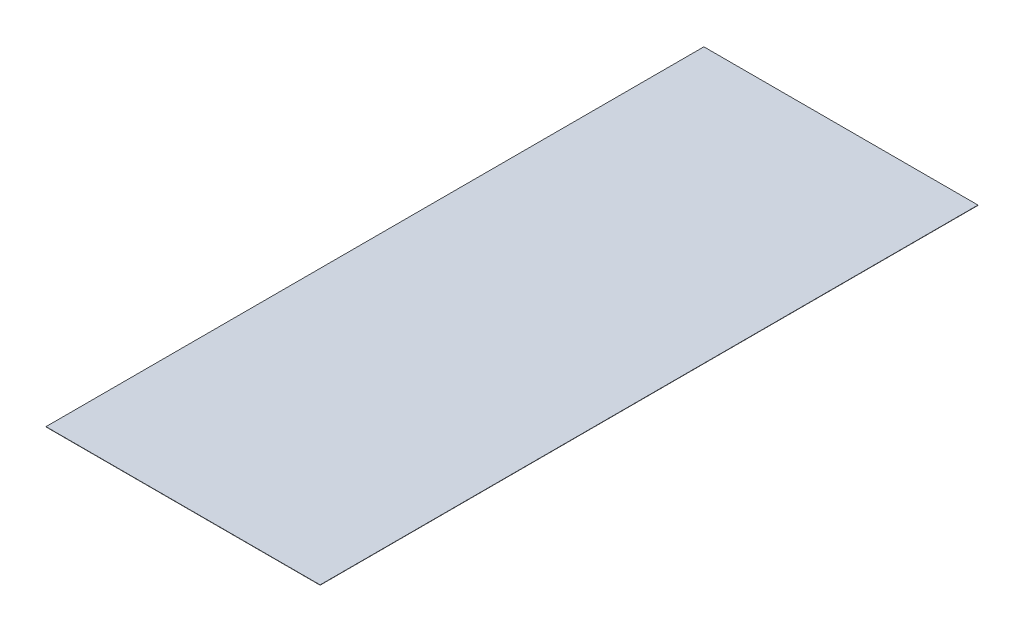
ISO-10303-21;
HEADER;
FILE_DESCRIPTION(('STEP AP214'),'2;1');
FILE_NAME('part.step','',(''),(''),'','','');
FILE_SCHEMA(('AUTOMOTIVE_DESIGN { 1 0 10303 214 1 1 1 1 }'));
ENDSEC;
DATA;
#1=APPLICATION_CONTEXT('core data for automotive mechanical design processes');
#2=APPLICATION_PROTOCOL_DEFINITION('international standard','automotive_design',2000,#1);
#3=PRODUCT_CONTEXT('',#1,'mechanical');
#4=PRODUCT('Part','Part','',(#3));
#5=PRODUCT_RELATED_PRODUCT_CATEGORY('part','',(#4));
#6=PRODUCT_DEFINITION_FORMATION('','',#4);
#7=PRODUCT_DEFINITION_CONTEXT('part definition',#1,'design');
#8=PRODUCT_DEFINITION('design','',#6,#7);
#9=PRODUCT_DEFINITION_SHAPE('','',#8);
#10=(LENGTH_UNIT() NAMED_UNIT(*) SI_UNIT(.MILLI.,.METRE.));
#11=(NAMED_UNIT(*) PLANE_ANGLE_UNIT() SI_UNIT($,.RADIAN.));
#12=(NAMED_UNIT(*) SI_UNIT($,.STERADIAN.) SOLID_ANGLE_UNIT());
#13=UNCERTAINTY_MEASURE_WITH_UNIT(LENGTH_MEASURE(1.E-05),#10,'distance_accuracy_value','');
#14=(GEOMETRIC_REPRESENTATION_CONTEXT(3) GLOBAL_UNCERTAINTY_ASSIGNED_CONTEXT((#13)) GLOBAL_UNIT_ASSIGNED_CONTEXT((#10,
#11,#12)) REPRESENTATION_CONTEXT('',''));
#15=CARTESIAN_POINT('',(0.,0.,0.));
#16=DIRECTION('',(0.,0.,1.));
#17=DIRECTION('',(1.,0.,0.));
#18=AXIS2_PLACEMENT_3D('',#15,#16,#17);
#19=CARTESIAN_POINT('',(-500.,1.,-1200.));
#20=DIRECTION('',(1.,0.,0.));
#21=DIRECTION('',(0.,0.,-1.));
#22=AXIS2_PLACEMENT_3D('',#19,#20,#21);
#23=PLANE('',#22);
#24=DIRECTION('',(0.,0.,1.));
#25=VECTOR('',#24,1.);
#26=CARTESIAN_POINT('',(-500.,0.,-1200.));
#27=LINE('',#26,#25);
#28=CARTESIAN_POINT('',(-500.,0.,-1200.));
#29=VERTEX_POINT('',#28);
#30=CARTESIAN_POINT('',(-500.,0.,1200.));
#31=VERTEX_POINT('',#30);
#32=EDGE_CURVE('E113',#29,#31,#27,.T.);
#33=ORIENTED_EDGE('',*,*,#32,.T.);
#34=DIRECTION('',(0.,-1.,0.));
#35=VECTOR('',#34,1.);
#36=CARTESIAN_POINT('',(-500.,1.,1200.));
#37=LINE('',#36,#35);
#38=CARTESIAN_POINT('',(-500.,1.,1200.));
#39=VERTEX_POINT('',#38);
#40=EDGE_CURVE('E11',#39,#31,#37,.T.);
#41=ORIENTED_EDGE('',*,*,#40,.F.);
#42=DIRECTION('',(0.,0.,1.));
#43=VECTOR('',#42,1.);
#44=CARTESIAN_POINT('',(-500.,1.,-1200.));
#45=LINE('',#44,#43);
#46=CARTESIAN_POINT('',(-500.,1.,-1200.));
#47=VERTEX_POINT('',#46);
#48=EDGE_CURVE('E97',#47,#39,#45,.T.);
#49=ORIENTED_EDGE('',*,*,#48,.F.);
#50=DIRECTION('',(0.,-1.,0.));
#51=VECTOR('',#50,1.);
#52=CARTESIAN_POINT('',(-500.,1.,-1200.));
#53=LINE('',#52,#51);
#54=EDGE_CURVE('E109',#47,#29,#53,.T.);
#55=ORIENTED_EDGE('',*,*,#54,.T.);
#56=EDGE_LOOP('',(#33,#41,#49,#55));
#57=FACE_BOUND('',#56,.T.);
#58=ADVANCED_FACE('F45',(#57),#23,.F.);
#59=CARTESIAN_POINT('',(500.,1.,1200.));
#60=DIRECTION('',(0.,0.,-1.));
#61=DIRECTION('',(-1.,0.,0.));
#62=AXIS2_PLACEMENT_3D('',#59,#60,#61);
#63=PLANE('',#62);
#64=DIRECTION('',(1.,0.,0.));
#65=VECTOR('',#64,1.);
#66=CARTESIAN_POINT('',(500.,0.,1200.));
#67=LINE('',#66,#65);
#68=CARTESIAN_POINT('',(500.,0.,1200.));
#69=VERTEX_POINT('',#68);
#70=EDGE_CURVE('E102',#31,#69,#67,.T.);
#71=ORIENTED_EDGE('',*,*,#70,.T.);
#72=DIRECTION('',(0.,-1.,0.));
#73=VECTOR('',#72,1.);
#74=CARTESIAN_POINT('',(500.,1.,1200.));
#75=LINE('',#74,#73);
#76=CARTESIAN_POINT('',(500.,1.,1200.));
#77=VERTEX_POINT('',#76);
#78=EDGE_CURVE('E54',#77,#69,#75,.T.);
#79=ORIENTED_EDGE('',*,*,#78,.F.);
#80=DIRECTION('',(1.,0.,0.));
#81=VECTOR('',#80,1.);
#82=CARTESIAN_POINT('',(500.,1.,1200.));
#83=LINE('',#82,#81);
#84=EDGE_CURVE('E92',#39,#77,#83,.T.);
#85=ORIENTED_EDGE('',*,*,#84,.F.);
#86=ORIENTED_EDGE('',*,*,#40,.T.);
#87=EDGE_LOOP('',(#71,#79,#85,#86));
#88=FACE_BOUND('',#87,.T.);
#89=ADVANCED_FACE('F101',(#88),#63,.F.);
#90=CARTESIAN_POINT('',(500.,1.,-1200.));
#91=DIRECTION('',(-1.,0.,0.));
#92=DIRECTION('',(0.,0.,1.));
#93=AXIS2_PLACEMENT_3D('',#90,#91,#92);
#94=PLANE('',#93);
#95=DIRECTION('',(0.,0.,-1.));
#96=VECTOR('',#95,1.);
#97=CARTESIAN_POINT('',(500.,0.,-1200.));
#98=LINE('',#97,#96);
#99=CARTESIAN_POINT('',(500.,0.,-1200.));
#100=VERTEX_POINT('',#99);
#101=EDGE_CURVE('E79',#69,#100,#98,.T.);
#102=ORIENTED_EDGE('',*,*,#101,.T.);
#103=DIRECTION('',(0.,-1.,0.));
#104=VECTOR('',#103,1.);
#105=CARTESIAN_POINT('',(500.,1.,-1200.));
#106=LINE('',#105,#104);
#107=CARTESIAN_POINT('',(500.,1.,-1200.));
#108=VERTEX_POINT('',#107);
#109=EDGE_CURVE('E104',#108,#100,#106,.T.);
#110=ORIENTED_EDGE('',*,*,#109,.F.);
#111=DIRECTION('',(0.,0.,-1.));
#112=VECTOR('',#111,1.);
#113=CARTESIAN_POINT('',(500.,1.,-1200.));
#114=LINE('',#113,#112);
#115=EDGE_CURVE('E95',#77,#108,#114,.T.);
#116=ORIENTED_EDGE('',*,*,#115,.F.);
#117=ORIENTED_EDGE('',*,*,#78,.T.);
#118=EDGE_LOOP('',(#102,#110,#116,#117));
#119=FACE_BOUND('',#118,.T.);
#120=ADVANCED_FACE('F105',(#119),#94,.F.);
#121=CARTESIAN_POINT('',(500.,1.,-1200.));
#122=DIRECTION('',(0.,0.,1.));
#123=DIRECTION('',(1.,0.,0.));
#124=AXIS2_PLACEMENT_3D('',#121,#122,#123);
#125=PLANE('',#124);
#126=DIRECTION('',(-1.,0.,0.));
#127=VECTOR('',#126,1.);
#128=CARTESIAN_POINT('',(500.,0.,-1200.));
#129=LINE('',#128,#127);
#130=EDGE_CURVE('E85',#100,#29,#129,.T.);
#131=ORIENTED_EDGE('',*,*,#130,.T.);
#132=ORIENTED_EDGE('',*,*,#54,.F.);
#133=DIRECTION('',(-1.,0.,0.));
#134=VECTOR('',#133,1.);
#135=CARTESIAN_POINT('',(500.,1.,-1200.));
#136=LINE('',#135,#134);
#137=EDGE_CURVE('E62',#108,#47,#136,.T.);
#138=ORIENTED_EDGE('',*,*,#137,.F.);
#139=ORIENTED_EDGE('',*,*,#109,.T.);
#140=EDGE_LOOP('',(#131,#132,#138,#139));
#141=FACE_BOUND('',#140,.T.);
#142=ADVANCED_FACE('F126',(#141),#125,.F.);
#143=CARTESIAN_POINT('',(0.,1.,0.));
#144=DIRECTION('',(0.,-1.,0.));
#145=DIRECTION('',(0.,0.,-1.));
#146=AXIS2_PLACEMENT_3D('',#143,#144,#145);
#147=PLANE('',#146);
#148=ORIENTED_EDGE('',*,*,#48,.T.);
#149=ORIENTED_EDGE('',*,*,#84,.T.);
#150=ORIENTED_EDGE('',*,*,#115,.T.);
#151=ORIENTED_EDGE('',*,*,#137,.T.);
#152=EDGE_LOOP('',(#148,#149,#150,#151));
#153=FACE_BOUND('',#152,.T.);
#154=ADVANCED_FACE('F93',(#153),#147,.F.);
#155=CARTESIAN_POINT('',(0.,0.,0.));
#156=DIRECTION('',(0.,-1.,0.));
#157=DIRECTION('',(0.,0.,-1.));
#158=AXIS2_PLACEMENT_3D('',#155,#156,#157);
#159=PLANE('',#158);
#160=ORIENTED_EDGE('',*,*,#32,.F.);
#161=ORIENTED_EDGE('',*,*,#130,.F.);
#162=ORIENTED_EDGE('',*,*,#101,.F.);
#163=ORIENTED_EDGE('',*,*,#70,.F.);
#164=EDGE_LOOP('',(#160,#161,#162,#163));
#165=FACE_BOUND('',#164,.T.);
#166=ADVANCED_FACE('F129',(#165),#159,.T.);
#167=CLOSED_SHELL('',(#58,#89,#120,#142,#154,#166));
#168=MANIFOLD_SOLID_BREP('B2',#167);
#169=ADVANCED_BREP_SHAPE_REPRESENTATION('',(#18,#168),#14);
#170=SHAPE_DEFINITION_REPRESENTATION(#9,#169);
ENDSEC;
END-ISO-10303-21;
